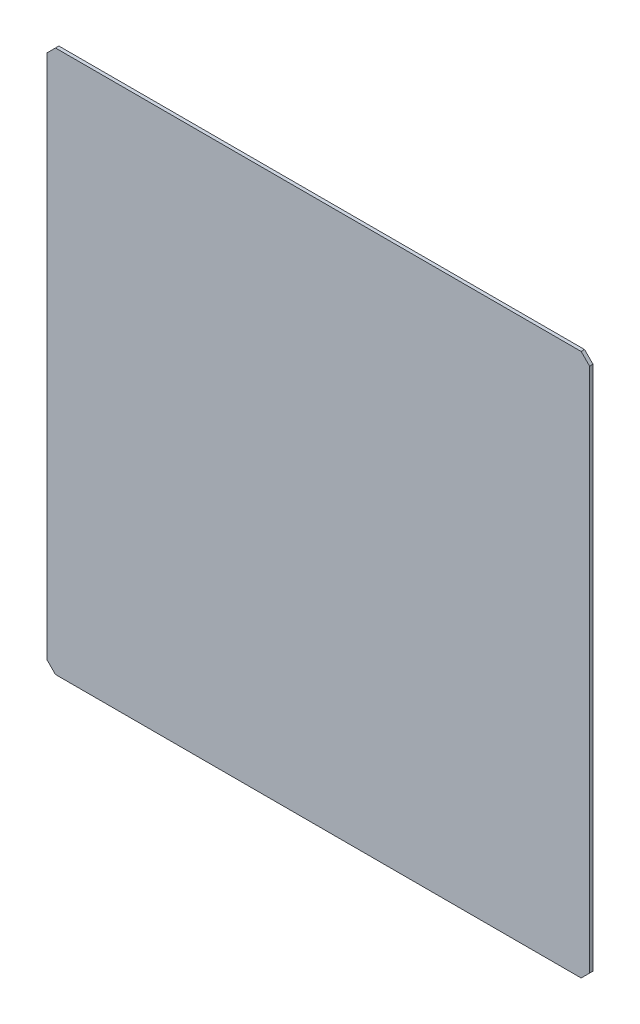
ISO-10303-21;
HEADER;
FILE_DESCRIPTION(('STEP AP214'),'2;1');
FILE_NAME('part.step','',(''),(''),'','','');
FILE_SCHEMA(('AUTOMOTIVE_DESIGN { 1 0 10303 214 1 1 1 1 }'));
ENDSEC;
DATA;
#1=APPLICATION_CONTEXT('core data for automotive mechanical design processes');
#2=APPLICATION_PROTOCOL_DEFINITION('international standard','automotive_design',2000,#1);
#3=PRODUCT_CONTEXT('',#1,'mechanical');
#4=PRODUCT('Part','Part','',(#3));
#5=PRODUCT_RELATED_PRODUCT_CATEGORY('part','',(#4));
#6=PRODUCT_DEFINITION_FORMATION('','',#4);
#7=PRODUCT_DEFINITION_CONTEXT('part definition',#1,'design');
#8=PRODUCT_DEFINITION('design','',#6,#7);
#9=PRODUCT_DEFINITION_SHAPE('','',#8);
#10=(LENGTH_UNIT() NAMED_UNIT(*) SI_UNIT(.MILLI.,.METRE.));
#11=(NAMED_UNIT(*) PLANE_ANGLE_UNIT() SI_UNIT($,.RADIAN.));
#12=(NAMED_UNIT(*) SI_UNIT($,.STERADIAN.) SOLID_ANGLE_UNIT());
#13=UNCERTAINTY_MEASURE_WITH_UNIT(LENGTH_MEASURE(1.E-05),#10,'distance_accuracy_value','');
#14=(GEOMETRIC_REPRESENTATION_CONTEXT(3) GLOBAL_UNCERTAINTY_ASSIGNED_CONTEXT((#13)) GLOBAL_UNIT_ASSIGNED_CONTEXT((#10,
#11,#12)) REPRESENTATION_CONTEXT('',''));
#15=CARTESIAN_POINT('',(0.,0.,0.));
#16=DIRECTION('',(0.,0.,1.));
#17=DIRECTION('',(1.,0.,0.));
#18=AXIS2_PLACEMENT_3D('',#15,#16,#17);
#19=CARTESIAN_POINT('',(160.,-160.,2.));
#20=DIRECTION('',(-1.,0.,0.));
#21=DIRECTION('',(0.,0.,1.));
#22=AXIS2_PLACEMENT_3D('',#19,#20,#21);
#23=PLANE('',#22);
#24=DIRECTION('',(0.,1.,0.));
#25=VECTOR('',#24,1.);
#26=CARTESIAN_POINT('',(160.,-160.,0.));
#27=LINE('',#26,#25);
#28=CARTESIAN_POINT('',(160.,-155.,0.));
#29=VERTEX_POINT('',#28);
#30=CARTESIAN_POINT('',(160.,155.,0.));
#31=VERTEX_POINT('',#30);
#32=EDGE_CURVE('E156',#29,#31,#27,.T.);
#33=ORIENTED_EDGE('',*,*,#32,.T.);
#34=DIRECTION('',(0.,0.,1.));
#35=VECTOR('',#34,1.);
#36=CARTESIAN_POINT('',(160.,155.,2.));
#37=LINE('',#36,#35);
#38=CARTESIAN_POINT('',(160.,155.,2.));
#39=VERTEX_POINT('',#38);
#40=EDGE_CURVE('E11',#31,#39,#37,.T.);
#41=ORIENTED_EDGE('',*,*,#40,.T.);
#42=DIRECTION('',(0.,1.,0.));
#43=VECTOR('',#42,1.);
#44=CARTESIAN_POINT('',(160.,-160.,2.));
#45=LINE('',#44,#43);
#46=CARTESIAN_POINT('',(160.,-155.,2.));
#47=VERTEX_POINT('',#46);
#48=EDGE_CURVE('E124',#47,#39,#45,.T.);
#49=ORIENTED_EDGE('',*,*,#48,.F.);
#50=DIRECTION('',(0.,0.,-1.));
#51=VECTOR('',#50,1.);
#52=CARTESIAN_POINT('',(160.,-155.,2.));
#53=LINE('',#52,#51);
#54=EDGE_CURVE('E40',#47,#29,#53,.T.);
#55=ORIENTED_EDGE('',*,*,#54,.T.);
#56=EDGE_LOOP('',(#33,#41,#49,#55));
#57=FACE_BOUND('',#56,.T.);
#58=ADVANCED_FACE('F32',(#57),#23,.F.);
#59=CARTESIAN_POINT('',(-160.,160.,2.));
#60=DIRECTION('',(0.,-1.,0.));
#61=DIRECTION('',(0.,0.,-1.));
#62=AXIS2_PLACEMENT_3D('',#59,#60,#61);
#63=PLANE('',#62);
#64=DIRECTION('',(-1.,0.,0.));
#65=VECTOR('',#64,1.);
#66=CARTESIAN_POINT('',(-160.,160.,0.));
#67=LINE('',#66,#65);
#68=CARTESIAN_POINT('',(155.,160.,0.));
#69=VERTEX_POINT('',#68);
#70=CARTESIAN_POINT('',(-155.,160.,0.));
#71=VERTEX_POINT('',#70);
#72=EDGE_CURVE('E129',#69,#71,#67,.T.);
#73=ORIENTED_EDGE('',*,*,#72,.T.);
#74=DIRECTION('',(0.,0.,1.));
#75=VECTOR('',#74,1.);
#76=CARTESIAN_POINT('',(-155.,160.,2.));
#77=LINE('',#76,#75);
#78=CARTESIAN_POINT('',(-155.,160.,2.));
#79=VERTEX_POINT('',#78);
#80=EDGE_CURVE('E47',#71,#79,#77,.T.);
#81=ORIENTED_EDGE('',*,*,#80,.T.);
#82=DIRECTION('',(-1.,0.,0.));
#83=VECTOR('',#82,1.);
#84=CARTESIAN_POINT('',(-160.,160.,2.));
#85=LINE('',#84,#83);
#86=CARTESIAN_POINT('',(155.,160.,2.));
#87=VERTEX_POINT('',#86);
#88=EDGE_CURVE('E127',#87,#79,#85,.T.);
#89=ORIENTED_EDGE('',*,*,#88,.F.);
#90=DIRECTION('',(0.,0.,-1.));
#91=VECTOR('',#90,1.);
#92=CARTESIAN_POINT('',(155.,160.,2.));
#93=LINE('',#92,#91);
#94=EDGE_CURVE('E148',#87,#69,#93,.T.);
#95=ORIENTED_EDGE('',*,*,#94,.T.);
#96=EDGE_LOOP('',(#73,#81,#89,#95));
#97=FACE_BOUND('',#96,.T.);
#98=ADVANCED_FACE('F176',(#97),#63,.F.);
#99=CARTESIAN_POINT('',(-160.,-160.,2.));
#100=DIRECTION('',(1.,0.,0.));
#101=DIRECTION('',(0.,0.,-1.));
#102=AXIS2_PLACEMENT_3D('',#99,#100,#101);
#103=PLANE('',#102);
#104=DIRECTION('',(0.,-1.,0.));
#105=VECTOR('',#104,1.);
#106=CARTESIAN_POINT('',(-160.,-160.,0.));
#107=LINE('',#106,#105);
#108=CARTESIAN_POINT('',(-160.,155.,0.));
#109=VERTEX_POINT('',#108);
#110=CARTESIAN_POINT('',(-160.,-155.,0.));
#111=VERTEX_POINT('',#110);
#112=EDGE_CURVE('E125',#109,#111,#107,.T.);
#113=ORIENTED_EDGE('',*,*,#112,.T.);
#114=DIRECTION('',(0.,0.,1.));
#115=VECTOR('',#114,1.);
#116=CARTESIAN_POINT('',(-160.,-155.,2.));
#117=LINE('',#116,#115);
#118=CARTESIAN_POINT('',(-160.,-155.,2.));
#119=VERTEX_POINT('',#118);
#120=EDGE_CURVE('E103',#111,#119,#117,.T.);
#121=ORIENTED_EDGE('',*,*,#120,.T.);
#122=DIRECTION('',(0.,-1.,0.));
#123=VECTOR('',#122,1.);
#124=CARTESIAN_POINT('',(-160.,-160.,2.));
#125=LINE('',#124,#123);
#126=CARTESIAN_POINT('',(-160.,155.,2.));
#127=VERTEX_POINT('',#126);
#128=EDGE_CURVE('E164',#127,#119,#125,.T.);
#129=ORIENTED_EDGE('',*,*,#128,.F.);
#130=DIRECTION('',(0.,0.,-1.));
#131=VECTOR('',#130,1.);
#132=CARTESIAN_POINT('',(-160.,155.,2.));
#133=LINE('',#132,#131);
#134=EDGE_CURVE('E108',#127,#109,#133,.T.);
#135=ORIENTED_EDGE('',*,*,#134,.T.);
#136=EDGE_LOOP('',(#113,#121,#129,#135));
#137=FACE_BOUND('',#136,.T.);
#138=ADVANCED_FACE('F175',(#137),#103,.F.);
#139=CARTESIAN_POINT('',(-160.,-160.,2.));
#140=DIRECTION('',(0.,1.,0.));
#141=DIRECTION('',(0.,0.,1.));
#142=AXIS2_PLACEMENT_3D('',#139,#140,#141);
#143=PLANE('',#142);
#144=DIRECTION('',(1.,0.,0.));
#145=VECTOR('',#144,1.);
#146=CARTESIAN_POINT('',(-160.,-160.,2.));
#147=LINE('',#146,#145);
#148=CARTESIAN_POINT('',(-155.,-160.,2.));
#149=VERTEX_POINT('',#148);
#150=CARTESIAN_POINT('',(155.,-160.,2.));
#151=VERTEX_POINT('',#150);
#152=EDGE_CURVE('E118',#149,#151,#147,.T.);
#153=ORIENTED_EDGE('',*,*,#152,.F.);
#154=DIRECTION('',(0.,0.,-1.));
#155=VECTOR('',#154,1.);
#156=CARTESIAN_POINT('',(-155.,-160.,2.));
#157=LINE('',#156,#155);
#158=CARTESIAN_POINT('',(-155.,-160.,0.));
#159=VERTEX_POINT('',#158);
#160=EDGE_CURVE('E102',#149,#159,#157,.T.);
#161=ORIENTED_EDGE('',*,*,#160,.T.);
#162=DIRECTION('',(1.,0.,0.));
#163=VECTOR('',#162,1.);
#164=CARTESIAN_POINT('',(-160.,-160.,0.));
#165=LINE('',#164,#163);
#166=CARTESIAN_POINT('',(155.,-160.,0.));
#167=VERTEX_POINT('',#166);
#168=EDGE_CURVE('E115',#159,#167,#165,.T.);
#169=ORIENTED_EDGE('',*,*,#168,.T.);
#170=DIRECTION('',(0.,0.,1.));
#171=VECTOR('',#170,1.);
#172=CARTESIAN_POINT('',(155.,-160.,2.));
#173=LINE('',#172,#171);
#174=EDGE_CURVE('E120',#167,#151,#173,.T.);
#175=ORIENTED_EDGE('',*,*,#174,.T.);
#176=EDGE_LOOP('',(#153,#161,#169,#175));
#177=FACE_BOUND('',#176,.T.);
#178=ADVANCED_FACE('F114',(#177),#143,.F.);
#179=CARTESIAN_POINT('',(0.,0.,2.));
#180=DIRECTION('',(0.,0.,-1.));
#181=DIRECTION('',(-1.,0.,0.));
#182=AXIS2_PLACEMENT_3D('',#179,#180,#181);
#183=PLANE('',#182);
#184=ORIENTED_EDGE('',*,*,#128,.T.);
#185=DIRECTION('',(-0.707106781186548,0.707106781186548,0.));
#186=VECTOR('',#185,1.);
#187=CARTESIAN_POINT('',(-155.,-160.,2.));
#188=LINE('',#187,#186);
#189=EDGE_CURVE('E146',#119,#149,#188,.F.);
#190=ORIENTED_EDGE('',*,*,#189,.T.);
#191=ORIENTED_EDGE('',*,*,#152,.T.);
#192=DIRECTION('',(-0.707106781186548,-0.707106781186548,0.));
#193=VECTOR('',#192,1.);
#194=CARTESIAN_POINT('',(160.,-155.,2.));
#195=LINE('',#194,#193);
#196=EDGE_CURVE('E141',#151,#47,#195,.F.);
#197=ORIENTED_EDGE('',*,*,#196,.T.);
#198=ORIENTED_EDGE('',*,*,#48,.T.);
#199=DIRECTION('',(0.707106781186548,-0.707106781186548,0.));
#200=VECTOR('',#199,1.);
#201=CARTESIAN_POINT('',(155.,160.,2.));
#202=LINE('',#201,#200);
#203=EDGE_CURVE('E54',#39,#87,#202,.F.);
#204=ORIENTED_EDGE('',*,*,#203,.T.);
#205=ORIENTED_EDGE('',*,*,#88,.T.);
#206=DIRECTION('',(0.707106781186548,0.707106781186548,0.));
#207=VECTOR('',#206,1.);
#208=CARTESIAN_POINT('',(-160.,155.,2.));
#209=LINE('',#208,#207);
#210=EDGE_CURVE('E144',#79,#127,#209,.F.);
#211=ORIENTED_EDGE('',*,*,#210,.T.);
#212=EDGE_LOOP('',(#184,#190,#191,#197,#198,#204,#205,#211));
#213=FACE_BOUND('',#212,.T.);
#214=ADVANCED_FACE('F168',(#213),#183,.F.);
#215=CARTESIAN_POINT('',(0.,0.,0.));
#216=DIRECTION('',(0.,0.,-1.));
#217=DIRECTION('',(-1.,0.,0.));
#218=AXIS2_PLACEMENT_3D('',#215,#216,#217);
#219=PLANE('',#218);
#220=ORIENTED_EDGE('',*,*,#168,.F.);
#221=DIRECTION('',(0.707106781186548,-0.707106781186548,0.));
#222=VECTOR('',#221,1.);
#223=CARTESIAN_POINT('',(-157.5,-157.5,0.));
#224=LINE('',#223,#222);
#225=EDGE_CURVE('E98',#159,#111,#224,.F.);
#226=ORIENTED_EDGE('',*,*,#225,.T.);
#227=ORIENTED_EDGE('',*,*,#112,.F.);
#228=DIRECTION('',(-0.707106781186548,-0.707106781186548,0.));
#229=VECTOR('',#228,1.);
#230=CARTESIAN_POINT('',(-157.5,157.5,0.));
#231=LINE('',#230,#229);
#232=EDGE_CURVE('E109',#109,#71,#231,.F.);
#233=ORIENTED_EDGE('',*,*,#232,.T.);
#234=ORIENTED_EDGE('',*,*,#72,.F.);
#235=DIRECTION('',(-0.707106781186548,0.707106781186548,0.));
#236=VECTOR('',#235,1.);
#237=CARTESIAN_POINT('',(157.5,157.5,0.));
#238=LINE('',#237,#236);
#239=EDGE_CURVE('E135',#69,#31,#238,.F.);
#240=ORIENTED_EDGE('',*,*,#239,.T.);
#241=ORIENTED_EDGE('',*,*,#32,.F.);
#242=DIRECTION('',(0.707106781186548,0.707106781186548,0.));
#243=VECTOR('',#242,1.);
#244=CARTESIAN_POINT('',(157.5,-157.5,0.));
#245=LINE('',#244,#243);
#246=EDGE_CURVE('E119',#29,#167,#245,.F.);
#247=ORIENTED_EDGE('',*,*,#246,.T.);
#248=EDGE_LOOP('',(#220,#226,#227,#233,#234,#240,#241,#247));
#249=FACE_BOUND('',#248,.T.);
#250=ADVANCED_FACE('F122',(#249),#219,.T.);
#251=CARTESIAN_POINT('',(-155.,-160.,2.));
#252=DIRECTION('',(0.707106781186547,0.707106781186547,0.));
#253=DIRECTION('',(0.,0.,-1.));
#254=AXIS2_PLACEMENT_3D('',#251,#252,#253);
#255=PLANE('',#254);
#256=ORIENTED_EDGE('',*,*,#189,.F.);
#257=ORIENTED_EDGE('',*,*,#120,.F.);
#258=ORIENTED_EDGE('',*,*,#225,.F.);
#259=ORIENTED_EDGE('',*,*,#160,.F.);
#260=EDGE_LOOP('',(#256,#257,#258,#259));
#261=FACE_BOUND('',#260,.T.);
#262=ADVANCED_FACE('F101',(#261),#255,.F.);
#263=CARTESIAN_POINT('',(-160.,155.,2.));
#264=DIRECTION('',(0.707106781186547,-0.707106781186547,0.));
#265=DIRECTION('',(0.,0.,-1.));
#266=AXIS2_PLACEMENT_3D('',#263,#264,#265);
#267=PLANE('',#266);
#268=ORIENTED_EDGE('',*,*,#210,.F.);
#269=ORIENTED_EDGE('',*,*,#80,.F.);
#270=ORIENTED_EDGE('',*,*,#232,.F.);
#271=ORIENTED_EDGE('',*,*,#134,.F.);
#272=EDGE_LOOP('',(#268,#269,#270,#271));
#273=FACE_BOUND('',#272,.T.);
#274=ADVANCED_FACE('F173',(#273),#267,.F.);
#275=CARTESIAN_POINT('',(155.,160.,2.));
#276=DIRECTION('',(-0.707106781186547,-0.707106781186547,0.));
#277=DIRECTION('',(0.,0.,-1.));
#278=AXIS2_PLACEMENT_3D('',#275,#276,#277);
#279=PLANE('',#278);
#280=ORIENTED_EDGE('',*,*,#203,.F.);
#281=ORIENTED_EDGE('',*,*,#40,.F.);
#282=ORIENTED_EDGE('',*,*,#239,.F.);
#283=ORIENTED_EDGE('',*,*,#94,.F.);
#284=EDGE_LOOP('',(#280,#281,#282,#283));
#285=FACE_BOUND('',#284,.T.);
#286=ADVANCED_FACE('F178',(#285),#279,.F.);
#287=CARTESIAN_POINT('',(160.,-155.,2.));
#288=DIRECTION('',(-0.707106781186547,0.707106781186547,0.));
#289=DIRECTION('',(0.,0.,-1.));
#290=AXIS2_PLACEMENT_3D('',#287,#288,#289);
#291=PLANE('',#290);
#292=ORIENTED_EDGE('',*,*,#196,.F.);
#293=ORIENTED_EDGE('',*,*,#174,.F.);
#294=ORIENTED_EDGE('',*,*,#246,.F.);
#295=ORIENTED_EDGE('',*,*,#54,.F.);
#296=EDGE_LOOP('',(#292,#293,#294,#295));
#297=FACE_BOUND('',#296,.T.);
#298=ADVANCED_FACE('F34',(#297),#291,.F.);
#299=CLOSED_SHELL('',(#58,#98,#138,#178,#214,#250,#262,#274,#286,#298));
#300=MANIFOLD_SOLID_BREP('B2',#299);
#301=ADVANCED_BREP_SHAPE_REPRESENTATION('',(#18,#300),#14);
#302=SHAPE_DEFINITION_REPRESENTATION(#9,#301);
ENDSEC;
END-ISO-10303-21;
